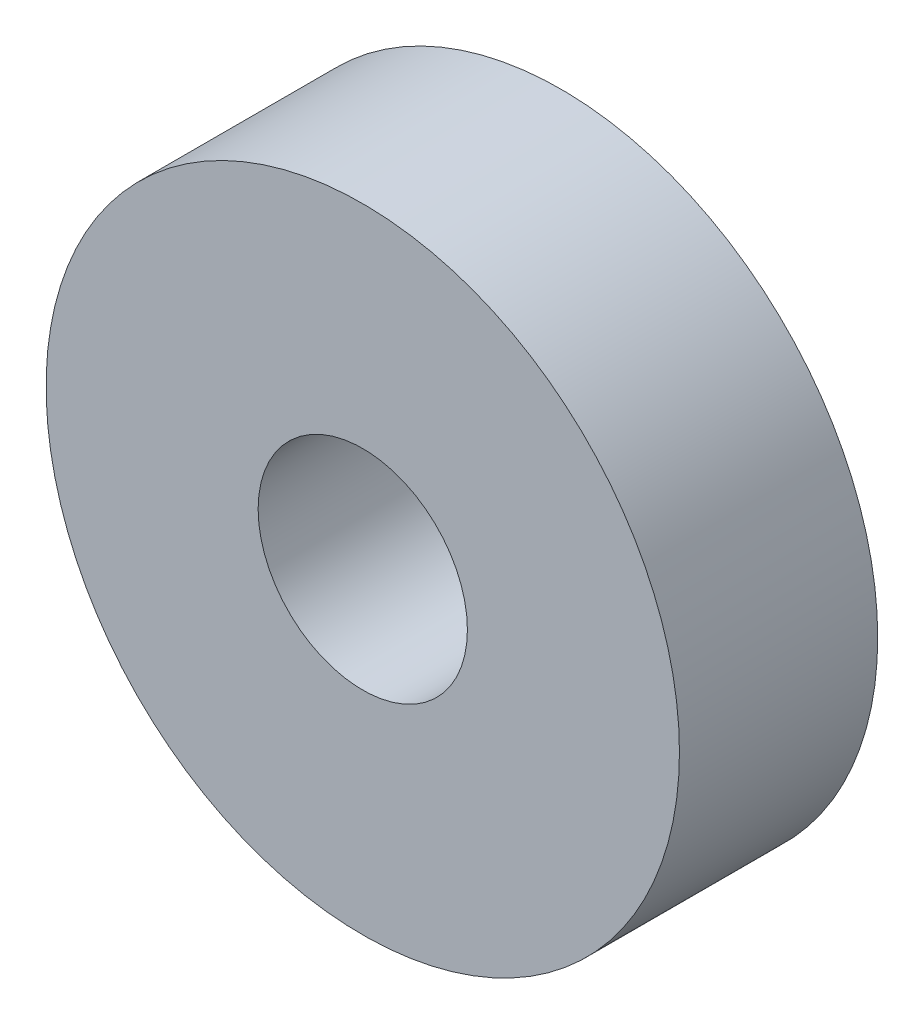
ISO-10303-21;
HEADER;
FILE_DESCRIPTION(('STEP AP214'),'2;1');
FILE_NAME('part.step','',(''),(''),'','','');
FILE_SCHEMA(('AUTOMOTIVE_DESIGN { 1 0 10303 214 1 1 1 1 }'));
ENDSEC;
DATA;
#1=APPLICATION_CONTEXT('core data for automotive mechanical design processes');
#2=APPLICATION_PROTOCOL_DEFINITION('international standard','automotive_design',2000,#1);
#3=PRODUCT_CONTEXT('',#1,'mechanical');
#4=PRODUCT('Part','Part','',(#3));
#5=PRODUCT_RELATED_PRODUCT_CATEGORY('part','',(#4));
#6=PRODUCT_DEFINITION_FORMATION('','',#4);
#7=PRODUCT_DEFINITION_CONTEXT('part definition',#1,'design');
#8=PRODUCT_DEFINITION('design','',#6,#7);
#9=PRODUCT_DEFINITION_SHAPE('','',#8);
#10=(LENGTH_UNIT() NAMED_UNIT(*) SI_UNIT(.MILLI.,.METRE.));
#11=(NAMED_UNIT(*) PLANE_ANGLE_UNIT() SI_UNIT($,.RADIAN.));
#12=(NAMED_UNIT(*) SI_UNIT($,.STERADIAN.) SOLID_ANGLE_UNIT());
#13=UNCERTAINTY_MEASURE_WITH_UNIT(LENGTH_MEASURE(1.E-05),#10,'distance_accuracy_value','');
#14=(GEOMETRIC_REPRESENTATION_CONTEXT(3) GLOBAL_UNCERTAINTY_ASSIGNED_CONTEXT((#13)) GLOBAL_UNIT_ASSIGNED_CONTEXT((#10,
#11,#12)) REPRESENTATION_CONTEXT('',''));
#15=CARTESIAN_POINT('',(0.,0.,0.));
#16=DIRECTION('',(0.,0.,1.));
#17=DIRECTION('',(1.,0.,0.));
#18=AXIS2_PLACEMENT_3D('',#15,#16,#17);
#19=CARTESIAN_POINT('',(0.,0.,7.2));
#20=DIRECTION('',(0.,0.,1.));
#21=DIRECTION('',(1.,0.,0.));
#22=AXIS2_PLACEMENT_3D('',#19,#20,#21);
#23=PLANE('',#22);
#24=CARTESIAN_POINT('',(0.,0.,7.2));
#25=DIRECTION('',(0.,0.,1.));
#26=DIRECTION('',(1.,0.,0.));
#27=AXIS2_PLACEMENT_3D('',#24,#25,#26);
#28=CIRCLE('',#27,11.5);
#29=CARTESIAN_POINT('',(11.5,0.,7.2));
#30=VERTEX_POINT('',#29);
#31=EDGE_CURVE('E10',#30,#30,#28,.T.);
#32=ORIENTED_EDGE('',*,*,#31,.T.);
#33=EDGE_LOOP('',(#32));
#34=FACE_BOUND('',#33,.T.);
#35=CARTESIAN_POINT('',(0.,0.,7.2));
#36=DIRECTION('',(0.,0.,1.));
#37=DIRECTION('',(1.,0.,0.));
#38=AXIS2_PLACEMENT_3D('',#35,#36,#37);
#39=CIRCLE('',#38,3.8);
#40=CARTESIAN_POINT('',(3.8,0.,7.2));
#41=VERTEX_POINT('',#40);
#42=EDGE_CURVE('E54',#41,#41,#39,.T.);
#43=ORIENTED_EDGE('',*,*,#42,.F.);
#44=EDGE_LOOP('',(#43));
#45=FACE_BOUND('',#44,.T.);
#46=ADVANCED_FACE('F41',(#34,#45),#23,.T.);
#47=CARTESIAN_POINT('',(0.,0.,0.));
#48=DIRECTION('',(0.,0.,1.));
#49=DIRECTION('',(1.,0.,0.));
#50=AXIS2_PLACEMENT_3D('',#47,#48,#49);
#51=PLANE('',#50);
#52=CARTESIAN_POINT('',(0.,0.,0.));
#53=DIRECTION('',(0.,0.,1.));
#54=DIRECTION('',(1.,0.,0.));
#55=AXIS2_PLACEMENT_3D('',#52,#53,#54);
#56=CIRCLE('',#55,11.5);
#57=CARTESIAN_POINT('',(11.5,0.,0.));
#58=VERTEX_POINT('',#57);
#59=EDGE_CURVE('E45',#58,#58,#56,.T.);
#60=ORIENTED_EDGE('',*,*,#59,.F.);
#61=EDGE_LOOP('',(#60));
#62=FACE_BOUND('',#61,.T.);
#63=CARTESIAN_POINT('',(0.,0.,0.));
#64=DIRECTION('',(0.,0.,1.));
#65=DIRECTION('',(1.,0.,0.));
#66=AXIS2_PLACEMENT_3D('',#63,#64,#65);
#67=CIRCLE('',#66,3.8);
#68=CARTESIAN_POINT('',(3.8,0.,0.));
#69=VERTEX_POINT('',#68);
#70=EDGE_CURVE('E56',#69,#69,#67,.T.);
#71=ORIENTED_EDGE('',*,*,#70,.T.);
#72=EDGE_LOOP('',(#71));
#73=FACE_BOUND('',#72,.T.);
#74=ADVANCED_FACE('F68',(#62,#73),#51,.F.);
#75=CARTESIAN_POINT('',(0.,0.,7.2));
#76=DIRECTION('',(0.,0.,-1.));
#77=DIRECTION('',(-1.,0.,0.));
#78=AXIS2_PLACEMENT_3D('',#75,#76,#77);
#79=CYLINDRICAL_SURFACE('',#78,11.5);
#80=ORIENTED_EDGE('',*,*,#31,.F.);
#81=EDGE_LOOP('',(#80));
#82=FACE_BOUND('',#81,.T.);
#83=ORIENTED_EDGE('',*,*,#59,.T.);
#84=EDGE_LOOP('',(#83));
#85=FACE_BOUND('',#84,.T.);
#86=ADVANCED_FACE('F43',(#82,#85),#79,.T.);
#87=CARTESIAN_POINT('',(0.,0.,7.2));
#88=DIRECTION('',(0.,0.,-1.));
#89=DIRECTION('',(-1.,0.,0.));
#90=AXIS2_PLACEMENT_3D('',#87,#88,#89);
#91=CYLINDRICAL_SURFACE('',#90,3.8);
#92=ORIENTED_EDGE('',*,*,#42,.T.);
#93=EDGE_LOOP('',(#92));
#94=FACE_BOUND('',#93,.T.);
#95=ORIENTED_EDGE('',*,*,#70,.F.);
#96=EDGE_LOOP('',(#95));
#97=FACE_BOUND('',#96,.T.);
#98=ADVANCED_FACE('F64',(#94,#97),#91,.F.);
#99=CLOSED_SHELL('',(#46,#74,#86,#98));
#100=MANIFOLD_SOLID_BREP('B2',#99);
#101=ADVANCED_BREP_SHAPE_REPRESENTATION('',(#18,#100),#14);
#102=SHAPE_DEFINITION_REPRESENTATION(#9,#101);
ENDSEC;
END-ISO-10303-21;
